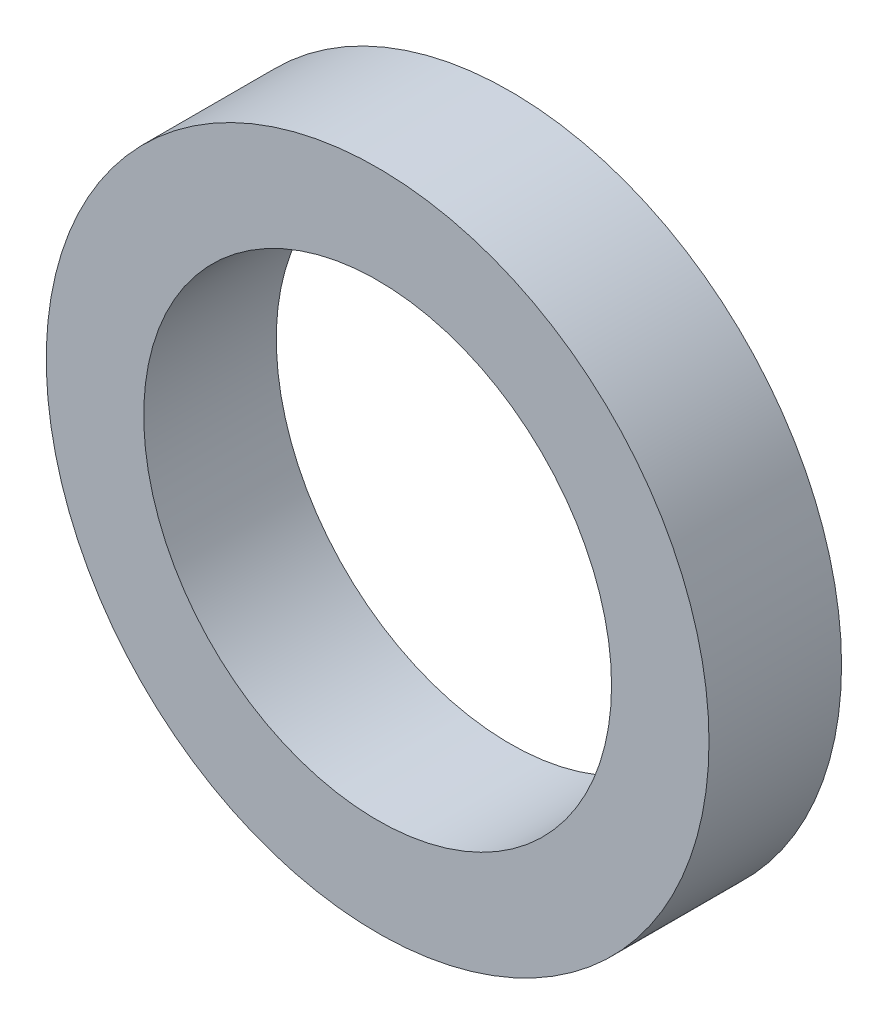
ISO-10303-21;
HEADER;
FILE_DESCRIPTION(('STEP AP214'),'2;1');
FILE_NAME('part.step','',(''),(''),'','','');
FILE_SCHEMA(('AUTOMOTIVE_DESIGN { 1 0 10303 214 1 1 1 1 }'));
ENDSEC;
DATA;
#1=APPLICATION_CONTEXT('core data for automotive mechanical design processes');
#2=APPLICATION_PROTOCOL_DEFINITION('international standard','automotive_design',2000,#1);
#3=PRODUCT_CONTEXT('',#1,'mechanical');
#4=PRODUCT('Part','Part','',(#3));
#5=PRODUCT_RELATED_PRODUCT_CATEGORY('part','',(#4));
#6=PRODUCT_DEFINITION_FORMATION('','',#4);
#7=PRODUCT_DEFINITION_CONTEXT('part definition',#1,'design');
#8=PRODUCT_DEFINITION('design','',#6,#7);
#9=PRODUCT_DEFINITION_SHAPE('','',#8);
#10=(LENGTH_UNIT() NAMED_UNIT(*) SI_UNIT(.MILLI.,.METRE.));
#11=(NAMED_UNIT(*) PLANE_ANGLE_UNIT() SI_UNIT($,.RADIAN.));
#12=(NAMED_UNIT(*) SI_UNIT($,.STERADIAN.) SOLID_ANGLE_UNIT());
#13=UNCERTAINTY_MEASURE_WITH_UNIT(LENGTH_MEASURE(1.E-05),#10,'distance_accuracy_value','');
#14=(GEOMETRIC_REPRESENTATION_CONTEXT(3) GLOBAL_UNCERTAINTY_ASSIGNED_CONTEXT((#13)) GLOBAL_UNIT_ASSIGNED_CONTEXT((#10,
#11,#12)) REPRESENTATION_CONTEXT('',''));
#15=CARTESIAN_POINT('',(0.,0.,0.));
#16=DIRECTION('',(0.,0.,1.));
#17=DIRECTION('',(1.,0.,0.));
#18=AXIS2_PLACEMENT_3D('',#15,#16,#17);
#19=CARTESIAN_POINT('',(0.,0.,17.));
#20=DIRECTION('',(0.,0.,1.));
#21=DIRECTION('',(1.,0.,0.));
#22=AXIS2_PLACEMENT_3D('',#19,#20,#21);
#23=PLANE('',#22);
#24=CARTESIAN_POINT('',(0.,0.,17.));
#25=DIRECTION('',(0.,0.,1.));
#26=DIRECTION('',(1.,0.,0.));
#27=AXIS2_PLACEMENT_3D('',#24,#25,#26);
#28=CIRCLE('',#27,42.5);
#29=CARTESIAN_POINT('',(42.5,0.,17.));
#30=VERTEX_POINT('',#29);
#31=EDGE_CURVE('E10',#30,#30,#28,.T.);
#32=ORIENTED_EDGE('',*,*,#31,.T.);
#33=EDGE_LOOP('',(#32));
#34=FACE_BOUND('',#33,.T.);
#35=CARTESIAN_POINT('',(0.,0.,17.));
#36=DIRECTION('',(0.,0.,1.));
#37=DIRECTION('',(1.,0.,0.));
#38=AXIS2_PLACEMENT_3D('',#35,#36,#37);
#39=CIRCLE('',#38,30.);
#40=CARTESIAN_POINT('',(30.,0.,17.));
#41=VERTEX_POINT('',#40);
#42=EDGE_CURVE('E50',#41,#41,#39,.T.);
#43=ORIENTED_EDGE('',*,*,#42,.F.);
#44=EDGE_LOOP('',(#43));
#45=FACE_BOUND('',#44,.T.);
#46=ADVANCED_FACE('F37',(#34,#45),#23,.T.);
#47=CARTESIAN_POINT('',(0.,0.,0.));
#48=DIRECTION('',(0.,0.,1.));
#49=DIRECTION('',(1.,0.,0.));
#50=AXIS2_PLACEMENT_3D('',#47,#48,#49);
#51=PLANE('',#50);
#52=CARTESIAN_POINT('',(0.,0.,0.));
#53=DIRECTION('',(0.,0.,1.));
#54=DIRECTION('',(1.,0.,0.));
#55=AXIS2_PLACEMENT_3D('',#52,#53,#54);
#56=CIRCLE('',#55,42.5);
#57=CARTESIAN_POINT('',(42.5,0.,0.));
#58=VERTEX_POINT('',#57);
#59=EDGE_CURVE('E41',#58,#58,#56,.T.);
#60=ORIENTED_EDGE('',*,*,#59,.F.);
#61=EDGE_LOOP('',(#60));
#62=FACE_BOUND('',#61,.T.);
#63=CARTESIAN_POINT('',(0.,0.,0.));
#64=DIRECTION('',(0.,0.,1.));
#65=DIRECTION('',(1.,0.,0.));
#66=AXIS2_PLACEMENT_3D('',#63,#64,#65);
#67=CIRCLE('',#66,30.);
#68=CARTESIAN_POINT('',(30.,0.,0.));
#69=VERTEX_POINT('',#68);
#70=EDGE_CURVE('E52',#69,#69,#67,.T.);
#71=ORIENTED_EDGE('',*,*,#70,.T.);
#72=EDGE_LOOP('',(#71));
#73=FACE_BOUND('',#72,.T.);
#74=ADVANCED_FACE('F64',(#62,#73),#51,.F.);
#75=CARTESIAN_POINT('',(0.,0.,17.));
#76=DIRECTION('',(0.,0.,-1.));
#77=DIRECTION('',(-1.,0.,0.));
#78=AXIS2_PLACEMENT_3D('',#75,#76,#77);
#79=CYLINDRICAL_SURFACE('',#78,42.5);
#80=ORIENTED_EDGE('',*,*,#31,.F.);
#81=EDGE_LOOP('',(#80));
#82=FACE_BOUND('',#81,.T.);
#83=ORIENTED_EDGE('',*,*,#59,.T.);
#84=EDGE_LOOP('',(#83));
#85=FACE_BOUND('',#84,.T.);
#86=ADVANCED_FACE('F39',(#82,#85),#79,.T.);
#87=CARTESIAN_POINT('',(0.,0.,17.));
#88=DIRECTION('',(0.,0.,-1.));
#89=DIRECTION('',(-1.,0.,0.));
#90=AXIS2_PLACEMENT_3D('',#87,#88,#89);
#91=CYLINDRICAL_SURFACE('',#90,30.);
#92=ORIENTED_EDGE('',*,*,#42,.T.);
#93=EDGE_LOOP('',(#92));
#94=FACE_BOUND('',#93,.T.);
#95=ORIENTED_EDGE('',*,*,#70,.F.);
#96=EDGE_LOOP('',(#95));
#97=FACE_BOUND('',#96,.T.);
#98=ADVANCED_FACE('F60',(#94,#97),#91,.F.);
#99=CLOSED_SHELL('',(#46,#74,#86,#98));
#100=MANIFOLD_SOLID_BREP('B2',#99);
#101=ADVANCED_BREP_SHAPE_REPRESENTATION('',(#18,#100),#14);
#102=SHAPE_DEFINITION_REPRESENTATION(#9,#101);
ENDSEC;
END-ISO-10303-21;
